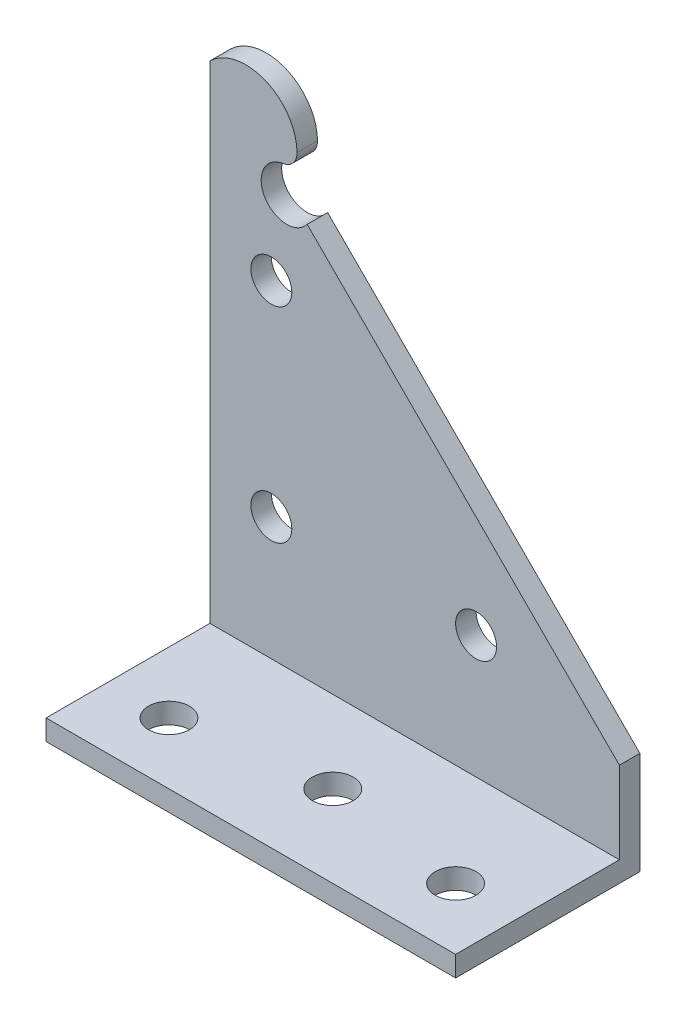
ISO-10303-21;
HEADER;
FILE_DESCRIPTION(('STEP AP214'),'2;1');
FILE_NAME('part.step','',(''),(''),'','','');
FILE_SCHEMA(('AUTOMOTIVE_DESIGN { 1 0 10303 214 1 1 1 1 }'));
ENDSEC;
DATA;
#1=APPLICATION_CONTEXT('core data for automotive mechanical design processes');
#2=APPLICATION_PROTOCOL_DEFINITION('international standard','automotive_design',2000,#1);
#3=PRODUCT_CONTEXT('',#1,'mechanical');
#4=PRODUCT('Part','Part','',(#3));
#5=PRODUCT_RELATED_PRODUCT_CATEGORY('part','',(#4));
#6=PRODUCT_DEFINITION_FORMATION('','',#4);
#7=PRODUCT_DEFINITION_CONTEXT('part definition',#1,'design');
#8=PRODUCT_DEFINITION('design','',#6,#7);
#9=PRODUCT_DEFINITION_SHAPE('','',#8);
#10=(LENGTH_UNIT() NAMED_UNIT(*) SI_UNIT(.MILLI.,.METRE.));
#11=(NAMED_UNIT(*) PLANE_ANGLE_UNIT() SI_UNIT($,.RADIAN.));
#12=(NAMED_UNIT(*) SI_UNIT($,.STERADIAN.) SOLID_ANGLE_UNIT());
#13=UNCERTAINTY_MEASURE_WITH_UNIT(LENGTH_MEASURE(1.E-05),#10,'distance_accuracy_value','');
#14=(GEOMETRIC_REPRESENTATION_CONTEXT(3) GLOBAL_UNCERTAINTY_ASSIGNED_CONTEXT((#13)) GLOBAL_UNIT_ASSIGNED_CONTEXT((#10,
#11,#12)) REPRESENTATION_CONTEXT('',''));
#15=CARTESIAN_POINT('',(0.,0.,0.));
#16=DIRECTION('',(0.,0.,1.));
#17=DIRECTION('',(1.,0.,0.));
#18=AXIS2_PLACEMENT_3D('',#15,#16,#17);
#19=CARTESIAN_POINT('',(10.9721473779918,73.1090309779918,3.175));
#20=DIRECTION('',(0.,0.,-1.));
#21=DIRECTION('',(-1.,0.,0.));
#22=AXIS2_PLACEMENT_3D('',#19,#20,#21);
#23=CYLINDRICAL_SURFACE('',#22,2.54);
#24=CARTESIAN_POINT('',(10.9721473779918,73.1090309779918,0.));
#25=DIRECTION('',(0.,0.,1.));
#26=DIRECTION('',(1.,0.,0.));
#27=AXIS2_PLACEMENT_3D('',#24,#25,#26);
#28=CIRCLE('',#27,2.54);
#29=CARTESIAN_POINT('',(13.5118409826828,73.1484821413682,0.));
#30=VERTEX_POINT('',#29);
#31=CARTESIAN_POINT('',(11.3395116834637,70.5957376272138,0.));
#32=VERTEX_POINT('',#31);
#33=EDGE_CURVE('E151',#30,#32,#28,.F.);
#34=ORIENTED_EDGE('',*,*,#33,.F.);
#35=DIRECTION('',(0.,0.,-1.));
#36=VECTOR('',#35,1.);
#37=CARTESIAN_POINT('',(13.5118409826828,73.1484821413682,3.175));
#38=LINE('',#37,#36);
#39=CARTESIAN_POINT('',(13.5118409826828,73.1484821413682,3.175));
#40=VERTEX_POINT('',#39);
#41=EDGE_CURVE('E11',#40,#30,#38,.T.);
#42=ORIENTED_EDGE('',*,*,#41,.F.);
#43=CARTESIAN_POINT('',(10.9721473779918,73.1090309779918,3.175));
#44=DIRECTION('',(0.,0.,1.));
#45=DIRECTION('',(1.,0.,0.));
#46=AXIS2_PLACEMENT_3D('',#43,#44,#45);
#47=CIRCLE('',#46,2.54);
#48=CARTESIAN_POINT('',(11.3395116834637,70.5957376272138,3.175));
#49=VERTEX_POINT('',#48);
#50=EDGE_CURVE('E187',#40,#49,#47,.F.);
#51=ORIENTED_EDGE('',*,*,#50,.T.);
#52=DIRECTION('',(0.,0.,-1.));
#53=VECTOR('',#52,1.);
#54=CARTESIAN_POINT('',(11.3395116834637,70.5957376272138,3.175));
#55=LINE('',#54,#53);
#56=EDGE_CURVE('E66',#49,#32,#55,.T.);
#57=ORIENTED_EDGE('',*,*,#56,.T.);
#58=EDGE_LOOP('',(#34,#42,#51,#57));
#59=FACE_BOUND('',#58,.T.);
#60=ADVANCED_FACE('F40',(#59),#23,.T.);
#61=CARTESIAN_POINT('',(5.5626,73.025,3.175));
#62=DIRECTION('',(0.,0.,-1.));
#63=DIRECTION('',(-1.,0.,0.));
#64=AXIS2_PLACEMENT_3D('',#61,#62,#63);
#65=CYLINDRICAL_SURFACE('',#64,7.9502);
#66=CARTESIAN_POINT('',(5.5626,73.025,0.));
#67=DIRECTION('',(0.,0.,1.));
#68=DIRECTION('',(1.,0.,0.));
#69=AXIS2_PLACEMENT_3D('',#66,#67,#68);
#70=CIRCLE('',#69,7.9502);
#71=CARTESIAN_POINT('',(0.,78.7050670136892,0.));
#72=VERTEX_POINT('',#71);
#73=EDGE_CURVE('E154',#72,#30,#70,.F.);
#74=ORIENTED_EDGE('',*,*,#73,.F.);
#75=DIRECTION('',(0.,0.,-1.));
#76=VECTOR('',#75,1.);
#77=CARTESIAN_POINT('',(0.,78.7050670136892,3.175));
#78=LINE('',#77,#76);
#79=CARTESIAN_POINT('',(0.,78.7050670136892,3.175));
#80=VERTEX_POINT('',#79);
#81=EDGE_CURVE('E49',#80,#72,#78,.T.);
#82=ORIENTED_EDGE('',*,*,#81,.F.);
#83=CARTESIAN_POINT('',(5.5626,73.025,3.175));
#84=DIRECTION('',(0.,0.,1.));
#85=DIRECTION('',(1.,0.,0.));
#86=AXIS2_PLACEMENT_3D('',#83,#84,#85);
#87=CIRCLE('',#86,7.9502);
#88=EDGE_CURVE('E233',#80,#40,#87,.F.);
#89=ORIENTED_EDGE('',*,*,#88,.T.);
#90=ORIENTED_EDGE('',*,*,#41,.T.);
#91=EDGE_LOOP('',(#74,#82,#89,#90));
#92=FACE_BOUND('',#91,.T.);
#93=ADVANCED_FACE('F245',(#92),#65,.T.);
#94=CARTESIAN_POINT('',(0.,0.,3.175));
#95=DIRECTION('',(-1.,0.,0.));
#96=DIRECTION('',(0.,0.,1.));
#97=AXIS2_PLACEMENT_3D('',#94,#95,#96);
#98=PLANE('',#97);
#99=DIRECTION('',(0.,1.,0.));
#100=VECTOR('',#99,1.);
#101=CARTESIAN_POINT('',(0.,0.,0.));
#102=LINE('',#101,#100);
#103=CARTESIAN_POINT('',(0.,0.,0.));
#104=VERTEX_POINT('',#103);
#105=EDGE_CURVE('E159',#104,#72,#102,.T.);
#106=ORIENTED_EDGE('',*,*,#105,.F.);
#107=DIRECTION('',(0.,0.,-1.));
#108=VECTOR('',#107,1.);
#109=CARTESIAN_POINT('',(0.,0.,3.175));
#110=LINE('',#109,#108);
#111=CARTESIAN_POINT('',(0.,0.,28.575));
#112=VERTEX_POINT('',#111);
#113=EDGE_CURVE('E194',#112,#104,#110,.T.);
#114=ORIENTED_EDGE('',*,*,#113,.F.);
#115=DIRECTION('',(0.,-1.,0.));
#116=VECTOR('',#115,1.);
#117=CARTESIAN_POINT('',(0.,0.,28.575));
#118=LINE('',#117,#116);
#119=CARTESIAN_POINT('',(0.,3.17500000000002,28.575));
#120=VERTEX_POINT('',#119);
#121=EDGE_CURVE('E213',#120,#112,#118,.T.);
#122=ORIENTED_EDGE('',*,*,#121,.F.);
#123=DIRECTION('',(0.,0.,-1.));
#124=VECTOR('',#123,1.);
#125=CARTESIAN_POINT('',(0.,3.17500000000002,28.575));
#126=LINE('',#125,#124);
#127=CARTESIAN_POINT('',(0.,3.17500000000002,3.175));
#128=VERTEX_POINT('',#127);
#129=EDGE_CURVE('E226',#120,#128,#126,.T.);
#130=ORIENTED_EDGE('',*,*,#129,.T.);
#131=DIRECTION('',(0.,1.,0.));
#132=VECTOR('',#131,1.);
#133=CARTESIAN_POINT('',(0.,0.,3.175));
#134=LINE('',#133,#132);
#135=EDGE_CURVE('E116',#128,#80,#134,.T.);
#136=ORIENTED_EDGE('',*,*,#135,.T.);
#137=ORIENTED_EDGE('',*,*,#81,.T.);
#138=EDGE_LOOP('',(#106,#114,#122,#130,#136,#137));
#139=FACE_BOUND('',#138,.T.);
#140=ADVANCED_FACE('F240',(#139),#98,.T.);
#141=CARTESIAN_POINT('',(0.,0.,3.175));
#142=DIRECTION('',(0.,1.,0.));
#143=DIRECTION('',(-1.,0.,0.));
#144=AXIS2_PLACEMENT_3D('',#141,#142,#143);
#145=PLANE('',#144);
#146=CARTESIAN_POINT('',(9.525,0.,19.05));
#147=DIRECTION('',(0.,1.,0.));
#148=DIRECTION('',(0.,0.,1.));
#149=AXIS2_PLACEMENT_3D('',#146,#147,#148);
#150=CIRCLE('',#149,3.175);
#151=CARTESIAN_POINT('',(9.525,0.,22.225));
#152=VERTEX_POINT('',#151);
#153=EDGE_CURVE('E203',#152,#152,#150,.T.);
#154=ORIENTED_EDGE('',*,*,#153,.T.);
#155=EDGE_LOOP('',(#154));
#156=FACE_BOUND('',#155,.T.);
#157=CARTESIAN_POINT('',(53.975,0.,19.05));
#158=DIRECTION('',(0.,1.,0.));
#159=DIRECTION('',(0.,0.,1.));
#160=AXIS2_PLACEMENT_3D('',#157,#158,#159);
#161=CIRCLE('',#160,3.175);
#162=CARTESIAN_POINT('',(53.975,0.,22.225));
#163=VERTEX_POINT('',#162);
#164=EDGE_CURVE('E308',#163,#163,#161,.T.);
#165=ORIENTED_EDGE('',*,*,#164,.T.);
#166=EDGE_LOOP('',(#165));
#167=FACE_BOUND('',#166,.T.);
#168=CARTESIAN_POINT('',(31.75,0.,15.875));
#169=DIRECTION('',(0.,1.,0.));
#170=DIRECTION('',(0.,0.,1.));
#171=AXIS2_PLACEMENT_3D('',#168,#169,#170);
#172=CIRCLE('',#171,3.175);
#173=CARTESIAN_POINT('',(31.75,0.,19.05));
#174=VERTEX_POINT('',#173);
#175=EDGE_CURVE('E312',#174,#174,#172,.T.);
#176=ORIENTED_EDGE('',*,*,#175,.T.);
#177=EDGE_LOOP('',(#176));
#178=FACE_BOUND('',#177,.T.);
#179=DIRECTION('',(1.,0.,0.));
#180=VECTOR('',#179,1.);
#181=CARTESIAN_POINT('',(0.,0.,0.));
#182=LINE('',#181,#180);
#183=CARTESIAN_POINT('',(63.5,0.,0.));
#184=VERTEX_POINT('',#183);
#185=EDGE_CURVE('E163',#104,#184,#182,.T.);
#186=ORIENTED_EDGE('',*,*,#185,.T.);
#187=DIRECTION('',(0.,0.,-1.));
#188=VECTOR('',#187,1.);
#189=CARTESIAN_POINT('',(63.5,0.,3.175));
#190=LINE('',#189,#188);
#191=CARTESIAN_POINT('',(63.5,0.,28.575));
#192=VERTEX_POINT('',#191);
#193=EDGE_CURVE('E128',#192,#184,#190,.T.);
#194=ORIENTED_EDGE('',*,*,#193,.F.);
#195=DIRECTION('',(1.,0.,0.));
#196=VECTOR('',#195,1.);
#197=CARTESIAN_POINT('',(63.5,0.,28.575));
#198=LINE('',#197,#196);
#199=EDGE_CURVE('E220',#112,#192,#198,.T.);
#200=ORIENTED_EDGE('',*,*,#199,.F.);
#201=ORIENTED_EDGE('',*,*,#113,.T.);
#202=EDGE_LOOP('',(#186,#194,#200,#201));
#203=FACE_BOUND('',#202,.T.);
#204=ADVANCED_FACE('F253',(#156,#167,#178,#203),#145,.F.);
#205=CARTESIAN_POINT('',(63.5,0.,3.175));
#206=DIRECTION('',(-1.,0.,0.));
#207=DIRECTION('',(0.,0.,1.));
#208=AXIS2_PLACEMENT_3D('',#205,#206,#207);
#209=PLANE('',#208);
#210=DIRECTION('',(0.,1.,0.));
#211=VECTOR('',#210,1.);
#212=CARTESIAN_POINT('',(63.5,0.,0.));
#213=LINE('',#212,#211);
#214=CARTESIAN_POINT('',(63.5,15.875,0.));
#215=VERTEX_POINT('',#214);
#216=EDGE_CURVE('E123',#184,#215,#213,.T.);
#217=ORIENTED_EDGE('',*,*,#216,.T.);
#218=DIRECTION('',(0.,0.,-1.));
#219=VECTOR('',#218,1.);
#220=CARTESIAN_POINT('',(63.5,15.875,3.175));
#221=LINE('',#220,#219);
#222=CARTESIAN_POINT('',(63.5,15.875,3.175));
#223=VERTEX_POINT('',#222);
#224=EDGE_CURVE('E119',#223,#215,#221,.T.);
#225=ORIENTED_EDGE('',*,*,#224,.F.);
#226=DIRECTION('',(0.,1.,0.));
#227=VECTOR('',#226,1.);
#228=CARTESIAN_POINT('',(63.5,0.,3.175));
#229=LINE('',#228,#227);
#230=CARTESIAN_POINT('',(63.5,3.17500000000002,3.175));
#231=VERTEX_POINT('',#230);
#232=EDGE_CURVE('E104',#231,#223,#229,.T.);
#233=ORIENTED_EDGE('',*,*,#232,.F.);
#234=DIRECTION('',(0.,0.,-1.));
#235=VECTOR('',#234,1.);
#236=CARTESIAN_POINT('',(63.5,3.17500000000002,28.575));
#237=LINE('',#236,#235);
#238=CARTESIAN_POINT('',(63.5,3.17500000000002,28.575));
#239=VERTEX_POINT('',#238);
#240=EDGE_CURVE('E155',#239,#231,#237,.T.);
#241=ORIENTED_EDGE('',*,*,#240,.F.);
#242=DIRECTION('',(0.,1.,0.));
#243=VECTOR('',#242,1.);
#244=CARTESIAN_POINT('',(63.5,3.17500000000002,28.575));
#245=LINE('',#244,#243);
#246=EDGE_CURVE('E320',#192,#239,#245,.T.);
#247=ORIENTED_EDGE('',*,*,#246,.F.);
#248=ORIENTED_EDGE('',*,*,#193,.T.);
#249=EDGE_LOOP('',(#217,#225,#233,#241,#247,#248));
#250=FACE_BOUND('',#249,.T.);
#251=ADVANCED_FACE('F120',(#250),#209,.F.);
#252=CARTESIAN_POINT('',(39.6874999999999,39.6875,3.175));
#253=DIRECTION('',(-0.707106781186546,-0.707106781186549,0.));
#254=DIRECTION('',(0.707106781186549,-0.707106781186546,0.));
#255=AXIS2_PLACEMENT_3D('',#252,#253,#254);
#256=PLANE('',#255);
#257=DIRECTION('',(-0.707106781186549,0.707106781186546,0.));
#258=VECTOR('',#257,1.);
#259=CARTESIAN_POINT('',(39.6874999999999,39.6875,0.));
#260=LINE('',#259,#258);
#261=CARTESIAN_POINT('',(15.0803416705593,64.2946583294405,0.));
#262=VERTEX_POINT('',#261);
#263=EDGE_CURVE('E168',#215,#262,#260,.T.);
#264=ORIENTED_EDGE('',*,*,#263,.T.);
#265=DIRECTION('',(0.,0.,-1.));
#266=VECTOR('',#265,1.);
#267=CARTESIAN_POINT('',(15.0803416705593,64.2946583294405,3.175));
#268=LINE('',#267,#266);
#269=CARTESIAN_POINT('',(15.0803416705593,64.2946583294405,3.175));
#270=VERTEX_POINT('',#269);
#271=EDGE_CURVE('E129',#270,#262,#268,.T.);
#272=ORIENTED_EDGE('',*,*,#271,.F.);
#273=DIRECTION('',(-0.707106781186549,0.707106781186546,0.));
#274=VECTOR('',#273,1.);
#275=CARTESIAN_POINT('',(39.6874999999999,39.6875,3.175));
#276=LINE('',#275,#274);
#277=EDGE_CURVE('E110',#223,#270,#276,.T.);
#278=ORIENTED_EDGE('',*,*,#277,.F.);
#279=ORIENTED_EDGE('',*,*,#224,.T.);
#280=EDGE_LOOP('',(#264,#272,#278,#279));
#281=FACE_BOUND('',#280,.T.);
#282=ADVANCED_FACE('F131',(#281),#256,.F.);
#283=CARTESIAN_POINT('',(9.525,53.975,3.175));
#284=DIRECTION('',(0.,0.,-1.));
#285=DIRECTION('',(-1.,0.,0.));
#286=AXIS2_PLACEMENT_3D('',#283,#284,#285);
#287=CYLINDRICAL_SURFACE('',#286,3.175);
#288=CARTESIAN_POINT('',(9.525,53.975,3.175));
#289=DIRECTION('',(0.,0.,1.));
#290=DIRECTION('',(1.,0.,0.));
#291=AXIS2_PLACEMENT_3D('',#288,#289,#290);
#292=CIRCLE('',#291,3.175);
#293=CARTESIAN_POINT('',(12.7,53.975,3.175));
#294=VERTEX_POINT('',#293);
#295=EDGE_CURVE('E143',#294,#294,#292,.T.);
#296=ORIENTED_EDGE('',*,*,#295,.T.);
#297=EDGE_LOOP('',(#296));
#298=FACE_BOUND('',#297,.T.);
#299=CARTESIAN_POINT('',(9.525,53.975,0.));
#300=DIRECTION('',(0.,0.,1.));
#301=DIRECTION('',(1.,0.,0.));
#302=AXIS2_PLACEMENT_3D('',#299,#300,#301);
#303=CIRCLE('',#302,3.175);
#304=CARTESIAN_POINT('',(12.7,53.975,0.));
#305=VERTEX_POINT('',#304);
#306=EDGE_CURVE('E179',#305,#305,#303,.T.);
#307=ORIENTED_EDGE('',*,*,#306,.F.);
#308=EDGE_LOOP('',(#307));
#309=FACE_BOUND('',#308,.T.);
#310=ADVANCED_FACE('F263',(#298,#309),#287,.F.);
#311=CARTESIAN_POINT('',(41.275,22.225,3.175));
#312=DIRECTION('',(0.,0.,-1.));
#313=DIRECTION('',(-1.,0.,0.));
#314=AXIS2_PLACEMENT_3D('',#311,#312,#313);
#315=CYLINDRICAL_SURFACE('',#314,3.175);
#316=CARTESIAN_POINT('',(41.275,22.225,3.175));
#317=DIRECTION('',(0.,0.,1.));
#318=DIRECTION('',(1.,0.,0.));
#319=AXIS2_PLACEMENT_3D('',#316,#317,#318);
#320=CIRCLE('',#319,3.175);
#321=CARTESIAN_POINT('',(44.45,22.225,3.175));
#322=VERTEX_POINT('',#321);
#323=EDGE_CURVE('E136',#322,#322,#320,.T.);
#324=ORIENTED_EDGE('',*,*,#323,.T.);
#325=EDGE_LOOP('',(#324));
#326=FACE_BOUND('',#325,.T.);
#327=CARTESIAN_POINT('',(41.275,22.225,0.));
#328=DIRECTION('',(0.,0.,1.));
#329=DIRECTION('',(1.,0.,0.));
#330=AXIS2_PLACEMENT_3D('',#327,#328,#329);
#331=CIRCLE('',#330,3.175);
#332=CARTESIAN_POINT('',(44.45,22.225,0.));
#333=VERTEX_POINT('',#332);
#334=EDGE_CURVE('E175',#333,#333,#331,.T.);
#335=ORIENTED_EDGE('',*,*,#334,.F.);
#336=EDGE_LOOP('',(#335));
#337=FACE_BOUND('',#336,.T.);
#338=ADVANCED_FACE('F268',(#326,#337),#315,.F.);
#339=CARTESIAN_POINT('',(11.9126,66.675,3.175));
#340=DIRECTION('',(0.,0.,-1.));
#341=DIRECTION('',(-1.,0.,0.));
#342=AXIS2_PLACEMENT_3D('',#339,#340,#341);
#343=CYLINDRICAL_SURFACE('',#342,3.96239999999999);
#344=CARTESIAN_POINT('',(11.9126,66.675,0.));
#345=DIRECTION('',(0.,0.,1.));
#346=DIRECTION('',(1.,0.,0.));
#347=AXIS2_PLACEMENT_3D('',#344,#345,#346);
#348=CIRCLE('',#347,3.96239999999999);
#349=EDGE_CURVE('E171',#32,#262,#348,.T.);
#350=ORIENTED_EDGE('',*,*,#349,.F.);
#351=ORIENTED_EDGE('',*,*,#56,.F.);
#352=CARTESIAN_POINT('',(11.9126,66.675,3.175));
#353=DIRECTION('',(0.,0.,1.));
#354=DIRECTION('',(1.,0.,0.));
#355=AXIS2_PLACEMENT_3D('',#352,#353,#354);
#356=CIRCLE('',#355,3.96239999999999);
#357=EDGE_CURVE('E133',#49,#270,#356,.T.);
#358=ORIENTED_EDGE('',*,*,#357,.T.);
#359=ORIENTED_EDGE('',*,*,#271,.T.);
#360=EDGE_LOOP('',(#350,#351,#358,#359));
#361=FACE_BOUND('',#360,.T.);
#362=ADVANCED_FACE('F264',(#361),#343,.F.);
#363=CARTESIAN_POINT('',(9.525,22.225,3.175));
#364=DIRECTION('',(0.,0.,-1.));
#365=DIRECTION('',(-1.,0.,0.));
#366=AXIS2_PLACEMENT_3D('',#363,#364,#365);
#367=CYLINDRICAL_SURFACE('',#366,3.175);
#368=CARTESIAN_POINT('',(9.525,22.225,3.175));
#369=DIRECTION('',(0.,0.,1.));
#370=DIRECTION('',(1.,0.,0.));
#371=AXIS2_PLACEMENT_3D('',#368,#369,#370);
#372=CIRCLE('',#371,3.175);
#373=CARTESIAN_POINT('',(12.7,22.225,3.175));
#374=VERTEX_POINT('',#373);
#375=EDGE_CURVE('E147',#374,#374,#372,.T.);
#376=ORIENTED_EDGE('',*,*,#375,.T.);
#377=EDGE_LOOP('',(#376));
#378=FACE_BOUND('',#377,.T.);
#379=CARTESIAN_POINT('',(9.525,22.225,0.));
#380=DIRECTION('',(0.,0.,1.));
#381=DIRECTION('',(1.,0.,0.));
#382=AXIS2_PLACEMENT_3D('',#379,#380,#381);
#383=CIRCLE('',#382,3.175);
#384=CARTESIAN_POINT('',(12.7,22.225,0.));
#385=VERTEX_POINT('',#384);
#386=EDGE_CURVE('E183',#385,#385,#383,.T.);
#387=ORIENTED_EDGE('',*,*,#386,.F.);
#388=EDGE_LOOP('',(#387));
#389=FACE_BOUND('',#388,.T.);
#390=ADVANCED_FACE('F267',(#378,#389),#367,.F.);
#391=CARTESIAN_POINT('',(0.,0.,3.175));
#392=DIRECTION('',(0.,0.,1.));
#393=DIRECTION('',(1.,0.,0.));
#394=AXIS2_PLACEMENT_3D('',#391,#392,#393);
#395=PLANE('',#394);
#396=DIRECTION('',(-1.,0.,0.));
#397=VECTOR('',#396,1.);
#398=CARTESIAN_POINT('',(0.,3.17500000000002,3.175));
#399=LINE('',#398,#397);
#400=EDGE_CURVE('E57',#231,#128,#399,.T.);
#401=ORIENTED_EDGE('',*,*,#400,.F.);
#402=ORIENTED_EDGE('',*,*,#232,.T.);
#403=ORIENTED_EDGE('',*,*,#277,.T.);
#404=ORIENTED_EDGE('',*,*,#357,.F.);
#405=ORIENTED_EDGE('',*,*,#50,.F.);
#406=ORIENTED_EDGE('',*,*,#88,.F.);
#407=ORIENTED_EDGE('',*,*,#135,.F.);
#408=EDGE_LOOP('',(#401,#402,#403,#404,#405,#406,#407));
#409=FACE_BOUND('',#408,.T.);
#410=ORIENTED_EDGE('',*,*,#323,.F.);
#411=EDGE_LOOP('',(#410));
#412=FACE_BOUND('',#411,.T.);
#413=ORIENTED_EDGE('',*,*,#295,.F.);
#414=EDGE_LOOP('',(#413));
#415=FACE_BOUND('',#414,.T.);
#416=ORIENTED_EDGE('',*,*,#375,.F.);
#417=EDGE_LOOP('',(#416));
#418=FACE_BOUND('',#417,.T.);
#419=ADVANCED_FACE('F106',(#409,#412,#415,#418),#395,.T.);
#420=CARTESIAN_POINT('',(0.,0.,0.));
#421=DIRECTION('',(0.,0.,1.));
#422=DIRECTION('',(1.,0.,0.));
#423=AXIS2_PLACEMENT_3D('',#420,#421,#422);
#424=PLANE('',#423);
#425=ORIENTED_EDGE('',*,*,#33,.T.);
#426=ORIENTED_EDGE('',*,*,#349,.T.);
#427=ORIENTED_EDGE('',*,*,#263,.F.);
#428=ORIENTED_EDGE('',*,*,#216,.F.);
#429=ORIENTED_EDGE('',*,*,#185,.F.);
#430=ORIENTED_EDGE('',*,*,#105,.T.);
#431=ORIENTED_EDGE('',*,*,#73,.T.);
#432=EDGE_LOOP('',(#425,#426,#427,#428,#429,#430,#431));
#433=FACE_BOUND('',#432,.T.);
#434=ORIENTED_EDGE('',*,*,#334,.T.);
#435=EDGE_LOOP('',(#434));
#436=FACE_BOUND('',#435,.T.);
#437=ORIENTED_EDGE('',*,*,#306,.T.);
#438=EDGE_LOOP('',(#437));
#439=FACE_BOUND('',#438,.T.);
#440=ORIENTED_EDGE('',*,*,#386,.T.);
#441=EDGE_LOOP('',(#440));
#442=FACE_BOUND('',#441,.T.);
#443=ADVANCED_FACE('F278',(#433,#436,#439,#442),#424,.F.);
#444=CARTESIAN_POINT('',(0.,3.17500000000002,28.575));
#445=DIRECTION('',(0.,-1.,0.));
#446=DIRECTION('',(0.,0.,-1.));
#447=AXIS2_PLACEMENT_3D('',#444,#445,#446);
#448=PLANE('',#447);
#449=CARTESIAN_POINT('',(9.525,3.17500000000002,19.05));
#450=DIRECTION('',(0.,-1.,0.));
#451=DIRECTION('',(0.,0.,-1.));
#452=AXIS2_PLACEMENT_3D('',#449,#450,#451);
#453=CIRCLE('',#452,3.175);
#454=CARTESIAN_POINT('',(9.525,3.17500000000002,15.875));
#455=VERTEX_POINT('',#454);
#456=EDGE_CURVE('E43',#455,#455,#453,.T.);
#457=ORIENTED_EDGE('',*,*,#456,.T.);
#458=EDGE_LOOP('',(#457));
#459=FACE_BOUND('',#458,.T.);
#460=CARTESIAN_POINT('',(53.975,3.17500000000002,19.05));
#461=DIRECTION('',(0.,-1.,0.));
#462=DIRECTION('',(0.,0.,-1.));
#463=AXIS2_PLACEMENT_3D('',#460,#461,#462);
#464=CIRCLE('',#463,3.175);
#465=CARTESIAN_POINT('',(53.975,3.17500000000002,15.875));
#466=VERTEX_POINT('',#465);
#467=EDGE_CURVE('E202',#466,#466,#464,.T.);
#468=ORIENTED_EDGE('',*,*,#467,.T.);
#469=EDGE_LOOP('',(#468));
#470=FACE_BOUND('',#469,.T.);
#471=CARTESIAN_POINT('',(31.75,3.17500000000002,15.875));
#472=DIRECTION('',(0.,-1.,0.));
#473=DIRECTION('',(0.,0.,-1.));
#474=AXIS2_PLACEMENT_3D('',#471,#472,#473);
#475=CIRCLE('',#474,3.175);
#476=CARTESIAN_POINT('',(31.75,3.17500000000002,12.7));
#477=VERTEX_POINT('',#476);
#478=EDGE_CURVE('E199',#477,#477,#475,.T.);
#479=ORIENTED_EDGE('',*,*,#478,.T.);
#480=EDGE_LOOP('',(#479));
#481=FACE_BOUND('',#480,.T.);
#482=ORIENTED_EDGE('',*,*,#400,.T.);
#483=ORIENTED_EDGE('',*,*,#129,.F.);
#484=DIRECTION('',(-1.,0.,0.));
#485=VECTOR('',#484,1.);
#486=CARTESIAN_POINT('',(0.,3.17500000000002,28.575));
#487=LINE('',#486,#485);
#488=EDGE_CURVE('E224',#239,#120,#487,.T.);
#489=ORIENTED_EDGE('',*,*,#488,.F.);
#490=ORIENTED_EDGE('',*,*,#240,.T.);
#491=EDGE_LOOP('',(#482,#483,#489,#490));
#492=FACE_BOUND('',#491,.T.);
#493=ADVANCED_FACE('F281',(#459,#470,#481,#492),#448,.F.);
#494=CARTESIAN_POINT('',(0.,0.,28.575));
#495=DIRECTION('',(0.,0.,-1.));
#496=DIRECTION('',(-1.,0.,0.));
#497=AXIS2_PLACEMENT_3D('',#494,#495,#496);
#498=PLANE('',#497);
#499=ORIENTED_EDGE('',*,*,#121,.T.);
#500=ORIENTED_EDGE('',*,*,#199,.T.);
#501=ORIENTED_EDGE('',*,*,#246,.T.);
#502=ORIENTED_EDGE('',*,*,#488,.T.);
#503=EDGE_LOOP('',(#499,#500,#501,#502));
#504=FACE_BOUND('',#503,.T.);
#505=ADVANCED_FACE('F287',(#504),#498,.F.);
#506=CARTESIAN_POINT('',(31.75,0.,15.875));
#507=DIRECTION('',(0.,1.,0.));
#508=DIRECTION('',(0.,0.,1.));
#509=AXIS2_PLACEMENT_3D('',#506,#507,#508);
#510=CYLINDRICAL_SURFACE('',#509,3.175);
#511=ORIENTED_EDGE('',*,*,#175,.F.);
#512=EDGE_LOOP('',(#511));
#513=FACE_BOUND('',#512,.T.);
#514=ORIENTED_EDGE('',*,*,#478,.F.);
#515=EDGE_LOOP('',(#514));
#516=FACE_BOUND('',#515,.T.);
#517=ADVANCED_FACE('F290',(#513,#516),#510,.F.);
#518=CARTESIAN_POINT('',(53.975,0.,19.05));
#519=DIRECTION('',(0.,1.,0.));
#520=DIRECTION('',(0.,0.,1.));
#521=AXIS2_PLACEMENT_3D('',#518,#519,#520);
#522=CYLINDRICAL_SURFACE('',#521,3.175);
#523=ORIENTED_EDGE('',*,*,#164,.F.);
#524=EDGE_LOOP('',(#523));
#525=FACE_BOUND('',#524,.T.);
#526=ORIENTED_EDGE('',*,*,#467,.F.);
#527=EDGE_LOOP('',(#526));
#528=FACE_BOUND('',#527,.T.);
#529=ADVANCED_FACE('F294',(#525,#528),#522,.F.);
#530=CARTESIAN_POINT('',(9.525,0.,19.05));
#531=DIRECTION('',(0.,1.,0.));
#532=DIRECTION('',(0.,0.,1.));
#533=AXIS2_PLACEMENT_3D('',#530,#531,#532);
#534=CYLINDRICAL_SURFACE('',#533,3.175);
#535=ORIENTED_EDGE('',*,*,#153,.F.);
#536=EDGE_LOOP('',(#535));
#537=FACE_BOUND('',#536,.T.);
#538=ORIENTED_EDGE('',*,*,#456,.F.);
#539=EDGE_LOOP('',(#538));
#540=FACE_BOUND('',#539,.T.);
#541=ADVANCED_FACE('F298',(#537,#540),#534,.F.);
#542=CLOSED_SHELL('',(#60,#93,#140,#204,#251,#282,#310,#338,#362,#390,#419,#443,#493,#505,#517,
#529,#541));
#543=MANIFOLD_SOLID_BREP('B2',#542);
#544=ADVANCED_BREP_SHAPE_REPRESENTATION('',(#18,#543),#14);
#545=SHAPE_DEFINITION_REPRESENTATION(#9,#544);
ENDSEC;
END-ISO-10303-21;
